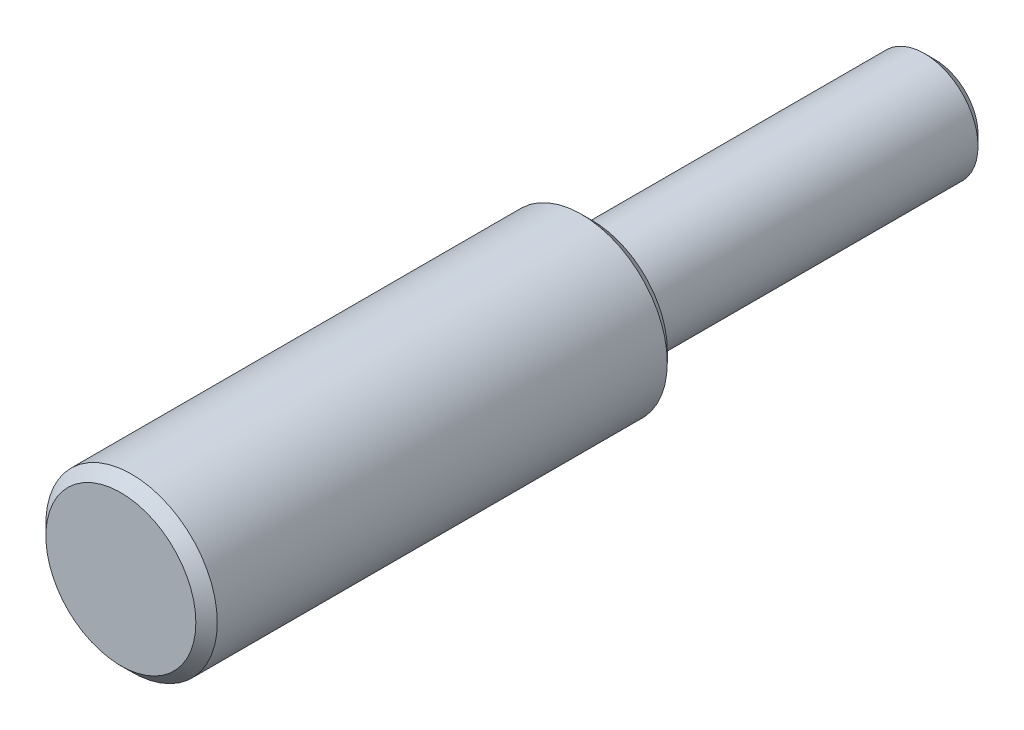
ISO-10303-21;
HEADER;
FILE_DESCRIPTION(('STEP AP214'),'2;1');
FILE_NAME('part.step','',(''),(''),'','','');
FILE_SCHEMA(('AUTOMOTIVE_DESIGN { 1 0 10303 214 1 1 1 1 }'));
ENDSEC;
DATA;
#1=APPLICATION_CONTEXT('core data for automotive mechanical design processes');
#2=APPLICATION_PROTOCOL_DEFINITION('international standard','automotive_design',2000,#1);
#3=PRODUCT_CONTEXT('',#1,'mechanical');
#4=PRODUCT('Part','Part','',(#3));
#5=PRODUCT_RELATED_PRODUCT_CATEGORY('part','',(#4));
#6=PRODUCT_DEFINITION_FORMATION('','',#4);
#7=PRODUCT_DEFINITION_CONTEXT('part definition',#1,'design');
#8=PRODUCT_DEFINITION('design','',#6,#7);
#9=PRODUCT_DEFINITION_SHAPE('','',#8);
#10=(LENGTH_UNIT() NAMED_UNIT(*) SI_UNIT(.MILLI.,.METRE.));
#11=(NAMED_UNIT(*) PLANE_ANGLE_UNIT() SI_UNIT($,.RADIAN.));
#12=(NAMED_UNIT(*) SI_UNIT($,.STERADIAN.) SOLID_ANGLE_UNIT());
#13=UNCERTAINTY_MEASURE_WITH_UNIT(LENGTH_MEASURE(1.E-05),#10,'distance_accuracy_value','');
#14=(GEOMETRIC_REPRESENTATION_CONTEXT(3) GLOBAL_UNCERTAINTY_ASSIGNED_CONTEXT((#13)) GLOBAL_UNIT_ASSIGNED_CONTEXT((#10,
#11,#12)) REPRESENTATION_CONTEXT('',''));
#15=CARTESIAN_POINT('',(0.,0.,0.));
#16=DIRECTION('',(0.,0.,1.));
#17=DIRECTION('',(1.,0.,0.));
#18=AXIS2_PLACEMENT_3D('',#15,#16,#17);
#19=CARTESIAN_POINT('',(0.,0.,16.));
#20=DIRECTION('',(0.,0.,-1.));
#21=DIRECTION('',(-1.,0.,0.));
#22=AXIS2_PLACEMENT_3D('',#19,#20,#21);
#23=CYLINDRICAL_SURFACE('',#22,2.5);
#24=CARTESIAN_POINT('',(0.,0.,15.5));
#25=DIRECTION('',(0.,0.,1.));
#26=DIRECTION('',(1.,0.,0.));
#27=AXIS2_PLACEMENT_3D('',#24,#25,#26);
#28=CIRCLE('',#27,2.5);
#29=CARTESIAN_POINT('',(2.5,0.,15.5));
#30=VERTEX_POINT('',#29);
#31=EDGE_CURVE('E10',#30,#30,#28,.F.);
#32=ORIENTED_EDGE('',*,*,#31,.T.);
#33=EDGE_LOOP('',(#32));
#34=FACE_BOUND('',#33,.T.);
#35=CARTESIAN_POINT('',(0.,0.,0.500000000000011));
#36=DIRECTION('',(0.,0.,1.));
#37=DIRECTION('',(1.,0.,0.));
#38=AXIS2_PLACEMENT_3D('',#35,#36,#37);
#39=CIRCLE('',#38,2.5);
#40=CARTESIAN_POINT('',(2.5,0.,0.500000000000011));
#41=VERTEX_POINT('',#40);
#42=EDGE_CURVE('E61',#41,#41,#39,.T.);
#43=ORIENTED_EDGE('',*,*,#42,.T.);
#44=EDGE_LOOP('',(#43));
#45=FACE_BOUND('',#44,.T.);
#46=ADVANCED_FACE('F32',(#34,#45),#23,.T.);
#47=CARTESIAN_POINT('',(0.,0.,0.));
#48=DIRECTION('',(0.,0.,1.));
#49=DIRECTION('',(1.,0.,0.));
#50=AXIS2_PLACEMENT_3D('',#47,#48,#49);
#51=PLANE('',#50);
#52=CARTESIAN_POINT('',(0.,0.,0.));
#53=DIRECTION('',(0.,0.,1.));
#54=DIRECTION('',(1.,0.,0.));
#55=AXIS2_PLACEMENT_3D('',#52,#53,#54);
#56=CIRCLE('',#55,1.99999999999999);
#57=CARTESIAN_POINT('',(1.99999999999999,0.,0.));
#58=VERTEX_POINT('',#57);
#59=EDGE_CURVE('E58',#58,#58,#56,.F.);
#60=ORIENTED_EDGE('',*,*,#59,.T.);
#61=EDGE_LOOP('',(#60));
#62=FACE_BOUND('',#61,.T.);
#63=ADVANCED_FACE('F84',(#62),#51,.F.);
#64=CARTESIAN_POINT('',(0.,0.,38.));
#65=DIRECTION('',(0.,0.,-1.));
#66=DIRECTION('',(-1.,0.,0.));
#67=AXIS2_PLACEMENT_3D('',#64,#65,#66);
#68=CYLINDRICAL_SURFACE('',#67,4.);
#69=CARTESIAN_POINT('',(0.,0.,37.5));
#70=DIRECTION('',(0.,0.,1.));
#71=DIRECTION('',(1.,0.,0.));
#72=AXIS2_PLACEMENT_3D('',#69,#70,#71);
#73=CIRCLE('',#72,4.);
#74=CARTESIAN_POINT('',(4.,0.,37.5));
#75=VERTEX_POINT('',#74);
#76=EDGE_CURVE('E47',#75,#75,#73,.F.);
#77=ORIENTED_EDGE('',*,*,#76,.T.);
#78=EDGE_LOOP('',(#77));
#79=FACE_BOUND('',#78,.T.);
#80=CARTESIAN_POINT('',(0.,0.,16.5));
#81=DIRECTION('',(0.,0.,1.));
#82=DIRECTION('',(1.,0.,0.));
#83=AXIS2_PLACEMENT_3D('',#80,#81,#82);
#84=CIRCLE('',#83,4.);
#85=CARTESIAN_POINT('',(4.,0.,16.5));
#86=VERTEX_POINT('',#85);
#87=EDGE_CURVE('E52',#86,#86,#84,.T.);
#88=ORIENTED_EDGE('',*,*,#87,.T.);
#89=EDGE_LOOP('',(#88));
#90=FACE_BOUND('',#89,.T.);
#91=ADVANCED_FACE('F88',(#79,#90),#68,.T.);
#92=CARTESIAN_POINT('',(0.,0.,38.));
#93=DIRECTION('',(0.,0.,1.));
#94=DIRECTION('',(1.,0.,0.));
#95=AXIS2_PLACEMENT_3D('',#92,#93,#94);
#96=PLANE('',#95);
#97=CARTESIAN_POINT('',(0.,0.,38.));
#98=DIRECTION('',(0.,0.,1.));
#99=DIRECTION('',(1.,0.,0.));
#100=AXIS2_PLACEMENT_3D('',#97,#98,#99);
#101=CIRCLE('',#100,3.5);
#102=CARTESIAN_POINT('',(3.5,0.,38.));
#103=VERTEX_POINT('',#102);
#104=EDGE_CURVE('E55',#103,#103,#101,.T.);
#105=ORIENTED_EDGE('',*,*,#104,.T.);
#106=EDGE_LOOP('',(#105));
#107=FACE_BOUND('',#106,.T.);
#108=ADVANCED_FACE('F79',(#107),#96,.T.);
#109=CARTESIAN_POINT('',(0.,0.,16.));
#110=DIRECTION('',(0.,0.,1.));
#111=DIRECTION('',(1.,0.,0.));
#112=AXIS2_PLACEMENT_3D('',#109,#110,#111);
#113=PLANE('',#112);
#114=CARTESIAN_POINT('',(0.,0.,16.));
#115=DIRECTION('',(0.,0.,1.));
#116=DIRECTION('',(1.,0.,0.));
#117=AXIS2_PLACEMENT_3D('',#114,#115,#116);
#118=CIRCLE('',#117,3.);
#119=CARTESIAN_POINT('',(3.,0.,16.));
#120=VERTEX_POINT('',#119);
#121=EDGE_CURVE('E39',#120,#120,#118,.T.);
#122=ORIENTED_EDGE('',*,*,#121,.T.);
#123=EDGE_LOOP('',(#122));
#124=FACE_BOUND('',#123,.T.);
#125=CARTESIAN_POINT('',(0.,0.,16.));
#126=DIRECTION('',(0.,0.,1.));
#127=DIRECTION('',(1.,0.,0.));
#128=AXIS2_PLACEMENT_3D('',#125,#126,#127);
#129=CIRCLE('',#128,3.5);
#130=CARTESIAN_POINT('',(3.5,0.,16.));
#131=VERTEX_POINT('',#130);
#132=EDGE_CURVE('E43',#131,#131,#129,.F.);
#133=ORIENTED_EDGE('',*,*,#132,.T.);
#134=EDGE_LOOP('',(#133));
#135=FACE_BOUND('',#134,.T.);
#136=ADVANCED_FACE('F69',(#124,#135),#113,.F.);
#137=CARTESIAN_POINT('',(0.,0.,0.500000000000011));
#138=DIRECTION('',(0.,0.,1.));
#139=DIRECTION('',(1.,0.,0.));
#140=AXIS2_PLACEMENT_3D('',#137,#138,#139);
#141=CONICAL_SURFACE('',#140,2.5,0.785398163397449);
#142=ORIENTED_EDGE('',*,*,#59,.F.);
#143=EDGE_LOOP('',(#142));
#144=FACE_BOUND('',#143,.T.);
#145=ORIENTED_EDGE('',*,*,#42,.F.);
#146=EDGE_LOOP('',(#145));
#147=FACE_BOUND('',#146,.T.);
#148=ADVANCED_FACE('F66',(#144,#147),#141,.T.);
#149=CARTESIAN_POINT('',(0.,0.,38.));
#150=DIRECTION('',(0.,0.,-1.));
#151=DIRECTION('',(-1.,0.,0.));
#152=AXIS2_PLACEMENT_3D('',#149,#150,#151);
#153=CONICAL_SURFACE('',#152,3.5,0.785398163397445);
#154=ORIENTED_EDGE('',*,*,#76,.F.);
#155=EDGE_LOOP('',(#154));
#156=FACE_BOUND('',#155,.T.);
#157=ORIENTED_EDGE('',*,*,#104,.F.);
#158=EDGE_LOOP('',(#157));
#159=FACE_BOUND('',#158,.T.);
#160=ADVANCED_FACE('F68',(#156,#159),#153,.T.);
#161=CARTESIAN_POINT('',(0.,0.,16.5));
#162=DIRECTION('',(0.,0.,1.));
#163=DIRECTION('',(1.,0.,0.));
#164=AXIS2_PLACEMENT_3D('',#161,#162,#163);
#165=CONICAL_SURFACE('',#164,4.,0.785398163397455);
#166=ORIENTED_EDGE('',*,*,#132,.F.);
#167=EDGE_LOOP('',(#166));
#168=FACE_BOUND('',#167,.T.);
#169=ORIENTED_EDGE('',*,*,#87,.F.);
#170=EDGE_LOOP('',(#169));
#171=FACE_BOUND('',#170,.T.);
#172=ADVANCED_FACE('F76',(#168,#171),#165,.T.);
#173=CARTESIAN_POINT('',(0.,0.,15.5));
#174=DIRECTION('',(0.,0.,1.));
#175=DIRECTION('',(1.,0.,0.));
#176=AXIS2_PLACEMENT_3D('',#173,#174,#175);
#177=TOROIDAL_SURFACE('',#176,3.,0.5);
#178=ORIENTED_EDGE('',*,*,#31,.F.);
#179=EDGE_LOOP('',(#178));
#180=FACE_BOUND('',#179,.T.);
#181=ORIENTED_EDGE('',*,*,#121,.F.);
#182=EDGE_LOOP('',(#181));
#183=FACE_BOUND('',#182,.T.);
#184=ADVANCED_FACE('F34',(#180,#183),#177,.F.);
#185=CLOSED_SHELL('',(#46,#63,#91,#108,#136,#148,#160,#172,#184));
#186=MANIFOLD_SOLID_BREP('B2',#185);
#187=ADVANCED_BREP_SHAPE_REPRESENTATION('',(#18,#186),#14);
#188=SHAPE_DEFINITION_REPRESENTATION(#9,#187);
ENDSEC;
END-ISO-10303-21;
